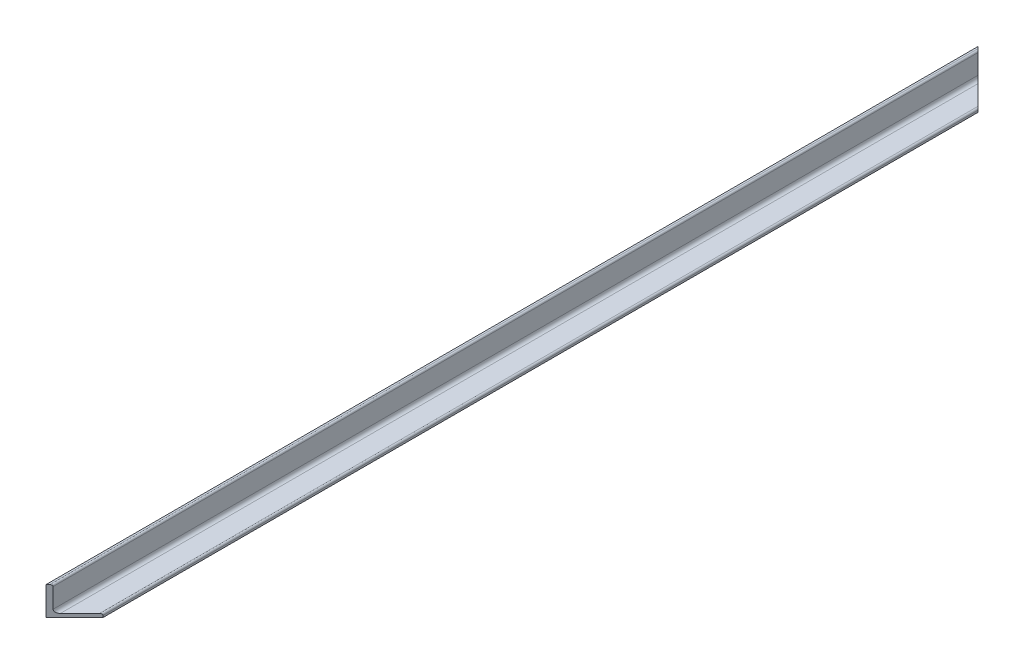
ISO-10303-21;
HEADER;
FILE_DESCRIPTION(('STEP AP214'),'2;1');
FILE_NAME('part.step','',(''),(''),'','','');
FILE_SCHEMA(('AUTOMOTIVE_DESIGN { 1 0 10303 214 1 1 1 1 }'));
ENDSEC;
DATA;
#1=APPLICATION_CONTEXT('core data for automotive mechanical design processes');
#2=APPLICATION_PROTOCOL_DEFINITION('international standard','automotive_design',2000,#1);
#3=PRODUCT_CONTEXT('',#1,'mechanical');
#4=PRODUCT('Part','Part','',(#3));
#5=PRODUCT_RELATED_PRODUCT_CATEGORY('part','',(#4));
#6=PRODUCT_DEFINITION_FORMATION('','',#4);
#7=PRODUCT_DEFINITION_CONTEXT('part definition',#1,'design');
#8=PRODUCT_DEFINITION('design','',#6,#7);
#9=PRODUCT_DEFINITION_SHAPE('','',#8);
#10=(LENGTH_UNIT() NAMED_UNIT(*) SI_UNIT(.MILLI.,.METRE.));
#11=(NAMED_UNIT(*) PLANE_ANGLE_UNIT() SI_UNIT($,.RADIAN.));
#12=(NAMED_UNIT(*) SI_UNIT($,.STERADIAN.) SOLID_ANGLE_UNIT());
#13=UNCERTAINTY_MEASURE_WITH_UNIT(LENGTH_MEASURE(1.E-05),#10,'distance_accuracy_value','');
#14=(GEOMETRIC_REPRESENTATION_CONTEXT(3) GLOBAL_UNCERTAINTY_ASSIGNED_CONTEXT((#13)) GLOBAL_UNIT_ASSIGNED_CONTEXT((#10,
#11,#12)) REPRESENTATION_CONTEXT('',''));
#15=CARTESIAN_POINT('',(0.,0.,0.));
#16=DIRECTION('',(0.,0.,1.));
#17=DIRECTION('',(1.,0.,0.));
#18=AXIS2_PLACEMENT_3D('',#15,#16,#17);
#19=CARTESIAN_POINT('',(-4.99999254E-08,0.,4.99999254E-08));
#20=DIRECTION('',(-0.707106781186547,0.,0.707106781186548));
#21=DIRECTION('',(0.707106781186548,0.,0.707106781186547));
#22=AXIS2_PLACEMENT_3D('',#19,#20,#21);
#23=PLANE('',#22);
#24=DIRECTION('',(-0.707106781186548,0.,-0.707106781186547));
#25=VECTOR('',#24,1.);
#26=CARTESIAN_POINT('',(2.4765,38.1,2.47650009999985));
#27=LINE('',#26,#25);
#28=CARTESIAN_POINT('',(2.4765,38.1,2.47650009999985));
#29=VERTEX_POINT('',#28);
#30=CARTESIAN_POINT('',(-1.22995529501972E-08,38.1,3.33697192566975E-08));
#31=VERTEX_POINT('',#30);
#32=EDGE_CURVE('E34',#29,#31,#27,.T.);
#33=ORIENTED_EDGE('',*,*,#32,.F.);
#34=CARTESIAN_POINT('',(2.4765,35.814,2.47650009999985));
#35=DIRECTION('',(-0.707106781186547,0.,0.707106781186548));
#36=DIRECTION('',(-0.707106781186548,0.,-0.707106781186547));
#37=AXIS2_PLACEMENT_3D('',#34,#35,#36);
#38=ELLIPSE('',#37,3.23289220358488,2.286);
#39=CARTESIAN_POINT('',(4.7625,35.814,4.76250009999985));
#40=VERTEX_POINT('',#39);
#41=EDGE_CURVE('E130',#40,#29,#38,.T.);
#42=ORIENTED_EDGE('',*,*,#41,.F.);
#43=DIRECTION('',(0.,1.,0.));
#44=VECTOR('',#43,1.);
#45=CARTESIAN_POINT('',(4.7625,9.5885,4.76250009999985));
#46=LINE('',#45,#44);
#47=CARTESIAN_POINT('',(4.7625,9.5885,4.76250009999985));
#48=VERTEX_POINT('',#47);
#49=EDGE_CURVE('E137',#48,#40,#46,.T.);
#50=ORIENTED_EDGE('',*,*,#49,.F.);
#51=CARTESIAN_POINT('',(9.5885,9.5885,9.58850009999985));
#52=DIRECTION('',(0.707106781186547,0.,-0.707106781186548));
#53=DIRECTION('',(-0.707106781186548,0.,-0.707106781186547));
#54=AXIS2_PLACEMENT_3D('',#51,#52,#53);
#55=ELLIPSE('',#54,6.82499465201256,4.826);
#56=CARTESIAN_POINT('',(9.5885,4.7625,9.58850009999985));
#57=VERTEX_POINT('',#56);
#58=EDGE_CURVE('E144',#57,#48,#55,.T.);
#59=ORIENTED_EDGE('',*,*,#58,.F.);
#60=DIRECTION('',(-0.707106781186548,0.,-0.707106781186547));
#61=VECTOR('',#60,1.);
#62=CARTESIAN_POINT('',(35.814,4.7625,35.8140000999999));
#63=LINE('',#62,#61);
#64=CARTESIAN_POINT('',(35.814,4.7625,35.8140000999999));
#65=VERTEX_POINT('',#64);
#66=EDGE_CURVE('E26',#65,#57,#63,.T.);
#67=ORIENTED_EDGE('',*,*,#66,.F.);
#68=CARTESIAN_POINT('',(35.814,2.47650000000003,35.8140000999999));
#69=DIRECTION('',(-0.707106781186547,0.,0.707106781186548));
#70=DIRECTION('',(-0.707106781186548,0.,-0.707106781186547));
#71=AXIS2_PLACEMENT_3D('',#68,#69,#70);
#72=ELLIPSE('',#71,3.23289220358491,2.286);
#73=CARTESIAN_POINT('',(38.1,2.47650000000003,38.1000000999998));
#74=VERTEX_POINT('',#73);
#75=EDGE_CURVE('E123',#74,#65,#72,.T.);
#76=ORIENTED_EDGE('',*,*,#75,.F.);
#77=DIRECTION('',(0.,1.,0.));
#78=VECTOR('',#77,1.);
#79=CARTESIAN_POINT('',(38.1,0.,38.1000000999998));
#80=LINE('',#79,#78);
#81=CARTESIAN_POINT('',(38.1,0.,38.1000000999998));
#82=VERTEX_POINT('',#81);
#83=EDGE_CURVE('E102',#82,#74,#80,.T.);
#84=ORIENTED_EDGE('',*,*,#83,.F.);
#85=DIRECTION('',(0.707106781186548,0.,0.707106781186547));
#86=VECTOR('',#85,1.);
#87=CARTESIAN_POINT('',(-4.9999926510223E-08,0.,4.9999924289777E-08));
#88=LINE('',#87,#86);
#89=CARTESIAN_POINT('',(-1.22995498551394E-08,0.,3.33697191745668E-08));
#90=VERTEX_POINT('',#89);
#91=EDGE_CURVE('E95',#90,#82,#88,.T.);
#92=ORIENTED_EDGE('',*,*,#91,.F.);
#93=DIRECTION('',(0.,1.,0.));
#94=VECTOR('',#93,1.);
#95=CARTESIAN_POINT('',(0.,0.,0.));
#96=LINE('',#95,#94);
#97=EDGE_CURVE('E10',#90,#31,#96,.T.);
#98=ORIENTED_EDGE('',*,*,#97,.T.);
#99=EDGE_LOOP('',(#33,#42,#50,#59,#67,#76,#84,#92,#98));
#100=FACE_BOUND('',#99,.T.);
#101=ADVANCED_FACE('F16',(#100),#23,.F.);
#102=CARTESIAN_POINT('',(9.5885,4.7625,0.));
#103=DIRECTION('',(0.,1.,0.));
#104=DIRECTION('',(0.,0.,1.));
#105=AXIS2_PLACEMENT_3D('',#102,#103,#104);
#106=PLANE('',#105);
#107=ORIENTED_EDGE('',*,*,#66,.T.);
#108=DIRECTION('',(0.,0.,1.));
#109=VECTOR('',#108,1.);
#110=CARTESIAN_POINT('',(9.5885,4.7625,9.58850009999985));
#111=LINE('',#110,#109);
#112=CARTESIAN_POINT('',(9.5885,4.7625,1235.0114999));
#113=VERTEX_POINT('',#112);
#114=EDGE_CURVE('E148',#57,#113,#111,.T.);
#115=ORIENTED_EDGE('',*,*,#114,.T.);
#116=DIRECTION('',(0.707106781186549,0.,-0.707106781186546));
#117=VECTOR('',#116,1.);
#118=CARTESIAN_POINT('',(9.58849999999998,4.7625,1235.0114999));
#119=LINE('',#118,#117);
#120=CARTESIAN_POINT('',(35.814,4.7625,1208.7859999));
#121=VERTEX_POINT('',#120);
#122=EDGE_CURVE('E146',#113,#121,#119,.T.);
#123=ORIENTED_EDGE('',*,*,#122,.T.);
#124=DIRECTION('',(0.,0.,1.));
#125=VECTOR('',#124,1.);
#126=CARTESIAN_POINT('',(35.814,4.7625,35.8140000999999));
#127=LINE('',#126,#125);
#128=EDGE_CURVE('E100',#65,#121,#127,.T.);
#129=ORIENTED_EDGE('',*,*,#128,.F.);
#130=EDGE_LOOP('',(#107,#115,#123,#129));
#131=FACE_BOUND('',#130,.T.);
#132=ADVANCED_FACE('F179',(#131),#106,.T.);
#133=CARTESIAN_POINT('',(9.5885,9.5885,0.));
#134=DIRECTION('',(0.,0.,1.));
#135=DIRECTION('',(1.,0.,0.));
#136=AXIS2_PLACEMENT_3D('',#133,#134,#135);
#137=CYLINDRICAL_SURFACE('',#136,4.826);
#138=ORIENTED_EDGE('',*,*,#58,.T.);
#139=DIRECTION('',(0.,0.,1.));
#140=VECTOR('',#139,1.);
#141=CARTESIAN_POINT('',(4.7625,9.5885,4.76250009999985));
#142=LINE('',#141,#140);
#143=CARTESIAN_POINT('',(4.7625,9.5885,1239.8374999));
#144=VERTEX_POINT('',#143);
#145=EDGE_CURVE('E141',#48,#144,#142,.T.);
#146=ORIENTED_EDGE('',*,*,#145,.T.);
#147=CARTESIAN_POINT('',(9.5885,9.5885,1235.0114999));
#148=DIRECTION('',(0.707106781186548,0.,0.707106781186548));
#149=DIRECTION('',(-0.707106781186548,0.,0.707106781186548));
#150=AXIS2_PLACEMENT_3D('',#147,#148,#149);
#151=ELLIPSE('',#150,6.82499465201256,4.826);
#152=EDGE_CURVE('E138',#144,#113,#151,.T.);
#153=ORIENTED_EDGE('',*,*,#152,.T.);
#154=ORIENTED_EDGE('',*,*,#114,.F.);
#155=EDGE_LOOP('',(#138,#146,#153,#154));
#156=FACE_BOUND('',#155,.T.);
#157=ADVANCED_FACE('F175',(#156),#137,.F.);
#158=CARTESIAN_POINT('',(4.7625,35.814,0.));
#159=DIRECTION('',(1.,0.,0.));
#160=DIRECTION('',(0.,0.,-1.));
#161=AXIS2_PLACEMENT_3D('',#158,#159,#160);
#162=PLANE('',#161);
#163=ORIENTED_EDGE('',*,*,#49,.T.);
#164=DIRECTION('',(0.,0.,1.));
#165=VECTOR('',#164,1.);
#166=CARTESIAN_POINT('',(4.7625,35.814,4.76250009999985));
#167=LINE('',#166,#165);
#168=CARTESIAN_POINT('',(4.7625,35.814,1239.8374999));
#169=VERTEX_POINT('',#168);
#170=EDGE_CURVE('E134',#40,#169,#167,.T.);
#171=ORIENTED_EDGE('',*,*,#170,.T.);
#172=DIRECTION('',(0.,-1.,0.));
#173=VECTOR('',#172,1.);
#174=CARTESIAN_POINT('',(4.76249999999992,35.814,1239.8374999));
#175=LINE('',#174,#173);
#176=EDGE_CURVE('E131',#169,#144,#175,.T.);
#177=ORIENTED_EDGE('',*,*,#176,.T.);
#178=ORIENTED_EDGE('',*,*,#145,.F.);
#179=EDGE_LOOP('',(#163,#171,#177,#178));
#180=FACE_BOUND('',#179,.T.);
#181=ADVANCED_FACE('F173',(#180),#162,.T.);
#182=CARTESIAN_POINT('',(2.4765,35.814,0.));
#183=DIRECTION('',(0.,0.,1.));
#184=DIRECTION('',(1.,0.,0.));
#185=AXIS2_PLACEMENT_3D('',#182,#183,#184);
#186=CYLINDRICAL_SURFACE('',#185,2.286);
#187=ORIENTED_EDGE('',*,*,#41,.T.);
#188=DIRECTION('',(0.,0.,1.));
#189=VECTOR('',#188,1.);
#190=CARTESIAN_POINT('',(2.4765,38.1,2.47650009999985));
#191=LINE('',#190,#189);
#192=CARTESIAN_POINT('',(2.4765,38.1,1242.1234999));
#193=VERTEX_POINT('',#192);
#194=EDGE_CURVE('E127',#29,#193,#191,.T.);
#195=ORIENTED_EDGE('',*,*,#194,.T.);
#196=CARTESIAN_POINT('',(2.4765,35.814,1242.1234999));
#197=DIRECTION('',(-0.707106781186548,0.,-0.707106781186547));
#198=DIRECTION('',(-0.707106781186547,0.,0.707106781186548));
#199=AXIS2_PLACEMENT_3D('',#196,#197,#198);
#200=ELLIPSE('',#199,3.23289220358491,2.286);
#201=EDGE_CURVE('E124',#193,#169,#200,.T.);
#202=ORIENTED_EDGE('',*,*,#201,.T.);
#203=ORIENTED_EDGE('',*,*,#170,.F.);
#204=EDGE_LOOP('',(#187,#195,#202,#203));
#205=FACE_BOUND('',#204,.T.);
#206=ADVANCED_FACE('F170',(#205),#186,.T.);
#207=CARTESIAN_POINT('',(622.29999995,0.,622.29999995));
#208=DIRECTION('',(-0.707106781186548,0.,-0.707106781186547));
#209=DIRECTION('',(-0.707106781186547,0.,0.707106781186548));
#210=AXIS2_PLACEMENT_3D('',#207,#208,#209);
#211=PLANE('',#210);
#212=ORIENTED_EDGE('',*,*,#122,.F.);
#213=ORIENTED_EDGE('',*,*,#152,.F.);
#214=ORIENTED_EDGE('',*,*,#176,.F.);
#215=ORIENTED_EDGE('',*,*,#201,.F.);
#216=DIRECTION('',(0.707106781186543,0.,-0.707106781186552));
#217=VECTOR('',#216,1.);
#218=CARTESIAN_POINT('',(-5.00000430160753E-08,38.1,1244.59999995));
#219=LINE('',#218,#217);
#220=CARTESIAN_POINT('',(-1.22995797140506E-08,38.1,1244.59999996663));
#221=VERTEX_POINT('',#220);
#222=EDGE_CURVE('E120',#221,#193,#219,.T.);
#223=ORIENTED_EDGE('',*,*,#222,.F.);
#224=DIRECTION('',(0.,1.,0.));
#225=VECTOR('',#224,1.);
#226=CARTESIAN_POINT('',(0.,0.,1244.6));
#227=LINE('',#226,#225);
#228=CARTESIAN_POINT('',(-1.22995419404859E-08,0.,1244.59999996663));
#229=VERTEX_POINT('',#228);
#230=EDGE_CURVE('E114',#229,#221,#227,.T.);
#231=ORIENTED_EDGE('',*,*,#230,.F.);
#232=DIRECTION('',(-0.707106781186548,0.,0.707106781186548));
#233=VECTOR('',#232,1.);
#234=CARTESIAN_POINT('',(38.1000000000001,0.,1206.4999999));
#235=LINE('',#234,#233);
#236=CARTESIAN_POINT('',(38.1,0.,1206.4999999));
#237=VERTEX_POINT('',#236);
#238=EDGE_CURVE('E83',#237,#229,#235,.T.);
#239=ORIENTED_EDGE('',*,*,#238,.F.);
#240=DIRECTION('',(0.,-1.,0.));
#241=VECTOR('',#240,1.);
#242=CARTESIAN_POINT('',(38.1,2.47650000000003,1206.4999999));
#243=LINE('',#242,#241);
#244=CARTESIAN_POINT('',(38.1,2.47650000000003,1206.4999999));
#245=VERTEX_POINT('',#244);
#246=EDGE_CURVE('E86',#245,#237,#243,.T.);
#247=ORIENTED_EDGE('',*,*,#246,.F.);
#248=CARTESIAN_POINT('',(35.814,2.47650000000003,1208.7859999));
#249=DIRECTION('',(-0.707106781186548,0.,-0.707106781186547));
#250=DIRECTION('',(-0.707106781186547,0.,0.707106781186548));
#251=AXIS2_PLACEMENT_3D('',#248,#249,#250);
#252=ELLIPSE('',#251,3.23289220358491,2.286);
#253=EDGE_CURVE('E89',#121,#245,#252,.T.);
#254=ORIENTED_EDGE('',*,*,#253,.F.);
#255=EDGE_LOOP('',(#212,#213,#214,#215,#223,#231,#239,#247,#254));
#256=FACE_BOUND('',#255,.T.);
#257=ADVANCED_FACE('F88',(#256),#211,.F.);
#258=CARTESIAN_POINT('',(0.,38.1,0.));
#259=DIRECTION('',(0.,1.,0.));
#260=DIRECTION('',(0.,0.,1.));
#261=AXIS2_PLACEMENT_3D('',#258,#259,#260);
#262=PLANE('',#261);
#263=ORIENTED_EDGE('',*,*,#32,.T.);
#264=DIRECTION('',(0.,0.,1.));
#265=VECTOR('',#264,1.);
#266=CARTESIAN_POINT('',(0.,38.1,0.));
#267=LINE('',#266,#265);
#268=EDGE_CURVE('E110',#31,#221,#267,.T.);
#269=ORIENTED_EDGE('',*,*,#268,.T.);
#270=ORIENTED_EDGE('',*,*,#222,.T.);
#271=ORIENTED_EDGE('',*,*,#194,.F.);
#272=EDGE_LOOP('',(#263,#269,#270,#271));
#273=FACE_BOUND('',#272,.T.);
#274=ADVANCED_FACE('F163',(#273),#262,.T.);
#275=CARTESIAN_POINT('',(35.814,2.47650000000003,0.));
#276=DIRECTION('',(0.,0.,1.));
#277=DIRECTION('',(1.,0.,0.));
#278=AXIS2_PLACEMENT_3D('',#275,#276,#277);
#279=CYLINDRICAL_SURFACE('',#278,2.286);
#280=ORIENTED_EDGE('',*,*,#75,.T.);
#281=ORIENTED_EDGE('',*,*,#128,.T.);
#282=ORIENTED_EDGE('',*,*,#253,.T.);
#283=DIRECTION('',(0.,0.,1.));
#284=VECTOR('',#283,1.);
#285=CARTESIAN_POINT('',(38.1,2.47650000000003,38.1000000999998));
#286=LINE('',#285,#284);
#287=EDGE_CURVE('E94',#74,#245,#286,.T.);
#288=ORIENTED_EDGE('',*,*,#287,.F.);
#289=EDGE_LOOP('',(#280,#281,#282,#288));
#290=FACE_BOUND('',#289,.T.);
#291=ADVANCED_FACE('F18',(#290),#279,.T.);
#292=CARTESIAN_POINT('',(38.1,2.47650000000003,0.));
#293=DIRECTION('',(1.,0.,0.));
#294=DIRECTION('',(0.,0.,-1.));
#295=AXIS2_PLACEMENT_3D('',#292,#293,#294);
#296=PLANE('',#295);
#297=ORIENTED_EDGE('',*,*,#83,.T.);
#298=ORIENTED_EDGE('',*,*,#287,.T.);
#299=ORIENTED_EDGE('',*,*,#246,.T.);
#300=DIRECTION('',(0.,0.,1.));
#301=VECTOR('',#300,1.);
#302=CARTESIAN_POINT('',(38.1,0.,38.1000000999998));
#303=LINE('',#302,#301);
#304=EDGE_CURVE('E111',#82,#237,#303,.T.);
#305=ORIENTED_EDGE('',*,*,#304,.F.);
#306=EDGE_LOOP('',(#297,#298,#299,#305));
#307=FACE_BOUND('',#306,.T.);
#308=ADVANCED_FACE('F104',(#307),#296,.T.);
#309=CARTESIAN_POINT('',(38.1,0.,0.));
#310=DIRECTION('',(0.,-1.,0.));
#311=DIRECTION('',(0.,0.,-1.));
#312=AXIS2_PLACEMENT_3D('',#309,#310,#311);
#313=PLANE('',#312);
#314=ORIENTED_EDGE('',*,*,#91,.T.);
#315=ORIENTED_EDGE('',*,*,#304,.T.);
#316=ORIENTED_EDGE('',*,*,#238,.T.);
#317=DIRECTION('',(0.,0.,1.));
#318=VECTOR('',#317,1.);
#319=CARTESIAN_POINT('',(0.,0.,0.));
#320=LINE('',#319,#318);
#321=EDGE_CURVE('E20',#90,#229,#320,.T.);
#322=ORIENTED_EDGE('',*,*,#321,.F.);
#323=EDGE_LOOP('',(#314,#315,#316,#322));
#324=FACE_BOUND('',#323,.T.);
#325=ADVANCED_FACE('F198',(#324),#313,.T.);
#326=CARTESIAN_POINT('',(0.,0.,0.));
#327=DIRECTION('',(-1.,0.,0.));
#328=DIRECTION('',(0.,0.,1.));
#329=AXIS2_PLACEMENT_3D('',#326,#327,#328);
#330=PLANE('',#329);
#331=ORIENTED_EDGE('',*,*,#230,.T.);
#332=ORIENTED_EDGE('',*,*,#268,.F.);
#333=ORIENTED_EDGE('',*,*,#97,.F.);
#334=ORIENTED_EDGE('',*,*,#321,.T.);
#335=EDGE_LOOP('',(#331,#332,#333,#334));
#336=FACE_BOUND('',#335,.T.);
#337=ADVANCED_FACE('F167',(#336),#330,.T.);
#338=CLOSED_SHELL('',(#101,#132,#157,#181,#206,#257,#274,#291,#308,#325,#337));
#339=MANIFOLD_SOLID_BREP('B1',#338);
#340=ADVANCED_BREP_SHAPE_REPRESENTATION('',(#18,#339),#14);
#341=SHAPE_DEFINITION_REPRESENTATION(#9,#340);
ENDSEC;
END-ISO-10303-21;
